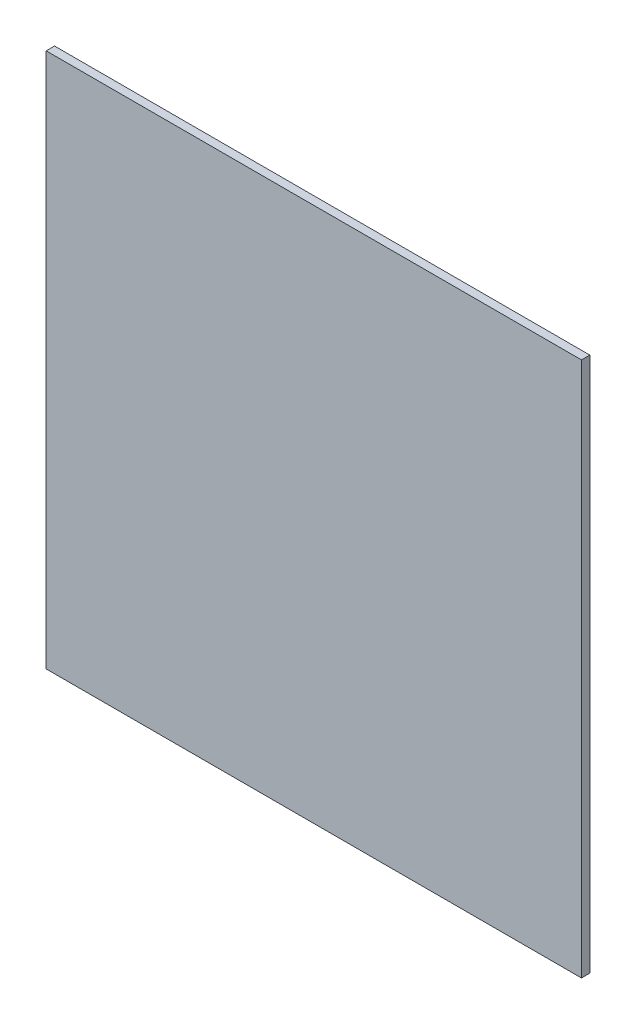
ISO-10303-21;
HEADER;
FILE_DESCRIPTION(('STEP AP214'),'2;1');
FILE_NAME('part.step','',(''),(''),'','','');
FILE_SCHEMA(('AUTOMOTIVE_DESIGN { 1 0 10303 214 1 1 1 1 }'));
ENDSEC;
DATA;
#1=APPLICATION_CONTEXT('core data for automotive mechanical design processes');
#2=APPLICATION_PROTOCOL_DEFINITION('international standard','automotive_design',2000,#1);
#3=PRODUCT_CONTEXT('',#1,'mechanical');
#4=PRODUCT('Part','Part','',(#3));
#5=PRODUCT_RELATED_PRODUCT_CATEGORY('part','',(#4));
#6=PRODUCT_DEFINITION_FORMATION('','',#4);
#7=PRODUCT_DEFINITION_CONTEXT('part definition',#1,'design');
#8=PRODUCT_DEFINITION('design','',#6,#7);
#9=PRODUCT_DEFINITION_SHAPE('','',#8);
#10=(LENGTH_UNIT() NAMED_UNIT(*) SI_UNIT(.MILLI.,.METRE.));
#11=(NAMED_UNIT(*) PLANE_ANGLE_UNIT() SI_UNIT($,.RADIAN.));
#12=(NAMED_UNIT(*) SI_UNIT($,.STERADIAN.) SOLID_ANGLE_UNIT());
#13=UNCERTAINTY_MEASURE_WITH_UNIT(LENGTH_MEASURE(1.E-05),#10,'distance_accuracy_value','');
#14=(GEOMETRIC_REPRESENTATION_CONTEXT(3) GLOBAL_UNCERTAINTY_ASSIGNED_CONTEXT((#13)) GLOBAL_UNIT_ASSIGNED_CONTEXT((#10,
#11,#12)) REPRESENTATION_CONTEXT('',''));
#15=CARTESIAN_POINT('',(0.,0.,0.));
#16=DIRECTION('',(0.,0.,1.));
#17=DIRECTION('',(1.,0.,0.));
#18=AXIS2_PLACEMENT_3D('',#15,#16,#17);
#19=CARTESIAN_POINT('',(-609.6,609.6,0.));
#20=DIRECTION('',(-1.,0.,0.));
#21=DIRECTION('',(0.,-1.,0.));
#22=AXIS2_PLACEMENT_3D('',#19,#20,#21);
#23=PLANE('',#22);
#24=DIRECTION('',(0.,-1.,0.));
#25=VECTOR('',#24,1.);
#26=CARTESIAN_POINT('',(-609.6,609.6,19.05));
#27=LINE('',#26,#25);
#28=CARTESIAN_POINT('',(-609.6,609.6,19.05));
#29=VERTEX_POINT('',#28);
#30=CARTESIAN_POINT('',(-609.6,-609.6,19.05));
#31=VERTEX_POINT('',#30);
#32=EDGE_CURVE('E110',#29,#31,#27,.T.);
#33=ORIENTED_EDGE('',*,*,#32,.F.);
#34=DIRECTION('',(0.,0.,1.));
#35=VECTOR('',#34,1.);
#36=CARTESIAN_POINT('',(-609.6,609.6,0.));
#37=LINE('',#36,#35);
#38=CARTESIAN_POINT('',(-609.6,609.6,0.));
#39=VERTEX_POINT('',#38);
#40=EDGE_CURVE('E12',#39,#29,#37,.T.);
#41=ORIENTED_EDGE('',*,*,#40,.F.);
#42=DIRECTION('',(0.,-1.,0.));
#43=VECTOR('',#42,1.);
#44=CARTESIAN_POINT('',(-609.6,609.6,0.));
#45=LINE('',#44,#43);
#46=CARTESIAN_POINT('',(-609.6,-609.6,0.));
#47=VERTEX_POINT('',#46);
#48=EDGE_CURVE('E104',#39,#47,#45,.T.);
#49=ORIENTED_EDGE('',*,*,#48,.T.);
#50=DIRECTION('',(0.,0.,1.));
#51=VECTOR('',#50,1.);
#52=CARTESIAN_POINT('',(-609.6,-609.6,0.));
#53=LINE('',#52,#51);
#54=EDGE_CURVE('E49',#47,#31,#53,.T.);
#55=ORIENTED_EDGE('',*,*,#54,.T.);
#56=EDGE_LOOP('',(#33,#41,#49,#55));
#57=FACE_BOUND('',#56,.T.);
#58=ADVANCED_FACE('F46',(#57),#23,.T.);
#59=CARTESIAN_POINT('',(609.6,609.6,0.));
#60=DIRECTION('',(0.,1.,0.));
#61=DIRECTION('',(-1.,0.,0.));
#62=AXIS2_PLACEMENT_3D('',#59,#60,#61);
#63=PLANE('',#62);
#64=DIRECTION('',(-1.,0.,0.));
#65=VECTOR('',#64,1.);
#66=CARTESIAN_POINT('',(609.6,609.6,19.05));
#67=LINE('',#66,#65);
#68=CARTESIAN_POINT('',(609.6,609.6,19.05));
#69=VERTEX_POINT('',#68);
#70=EDGE_CURVE('E106',#69,#29,#67,.T.);
#71=ORIENTED_EDGE('',*,*,#70,.F.);
#72=DIRECTION('',(0.,0.,1.));
#73=VECTOR('',#72,1.);
#74=CARTESIAN_POINT('',(609.6,609.6,0.));
#75=LINE('',#74,#73);
#76=CARTESIAN_POINT('',(609.6,609.6,0.));
#77=VERTEX_POINT('',#76);
#78=EDGE_CURVE('E55',#77,#69,#75,.T.);
#79=ORIENTED_EDGE('',*,*,#78,.F.);
#80=DIRECTION('',(-1.,0.,0.));
#81=VECTOR('',#80,1.);
#82=CARTESIAN_POINT('',(609.6,609.6,0.));
#83=LINE('',#82,#81);
#84=EDGE_CURVE('E101',#77,#39,#83,.T.);
#85=ORIENTED_EDGE('',*,*,#84,.T.);
#86=ORIENTED_EDGE('',*,*,#40,.T.);
#87=EDGE_LOOP('',(#71,#79,#85,#86));
#88=FACE_BOUND('',#87,.T.);
#89=ADVANCED_FACE('F120',(#88),#63,.T.);
#90=CARTESIAN_POINT('',(609.6,609.6,0.));
#91=DIRECTION('',(1.,0.,0.));
#92=DIRECTION('',(0.,1.,0.));
#93=AXIS2_PLACEMENT_3D('',#90,#91,#92);
#94=PLANE('',#93);
#95=DIRECTION('',(0.,1.,0.));
#96=VECTOR('',#95,1.);
#97=CARTESIAN_POINT('',(609.6,609.6,19.05));
#98=LINE('',#97,#96);
#99=CARTESIAN_POINT('',(609.6,-609.6,19.05));
#100=VERTEX_POINT('',#99);
#101=EDGE_CURVE('E96',#100,#69,#98,.T.);
#102=ORIENTED_EDGE('',*,*,#101,.F.);
#103=DIRECTION('',(0.,0.,1.));
#104=VECTOR('',#103,1.);
#105=CARTESIAN_POINT('',(609.6,-609.6,0.));
#106=LINE('',#105,#104);
#107=CARTESIAN_POINT('',(609.6,-609.6,0.));
#108=VERTEX_POINT('',#107);
#109=EDGE_CURVE('E91',#108,#100,#106,.T.);
#110=ORIENTED_EDGE('',*,*,#109,.F.);
#111=DIRECTION('',(0.,1.,0.));
#112=VECTOR('',#111,1.);
#113=CARTESIAN_POINT('',(609.6,609.6,0.));
#114=LINE('',#113,#112);
#115=EDGE_CURVE('E94',#108,#77,#114,.T.);
#116=ORIENTED_EDGE('',*,*,#115,.T.);
#117=ORIENTED_EDGE('',*,*,#78,.T.);
#118=EDGE_LOOP('',(#102,#110,#116,#117));
#119=FACE_BOUND('',#118,.T.);
#120=ADVANCED_FACE('F93',(#119),#94,.T.);
#121=CARTESIAN_POINT('',(609.6,-609.6,0.));
#122=DIRECTION('',(0.,-1.,0.));
#123=DIRECTION('',(1.,0.,0.));
#124=AXIS2_PLACEMENT_3D('',#121,#122,#123);
#125=PLANE('',#124);
#126=DIRECTION('',(1.,0.,0.));
#127=VECTOR('',#126,1.);
#128=CARTESIAN_POINT('',(609.6,-609.6,19.05));
#129=LINE('',#128,#127);
#130=EDGE_CURVE('E113',#31,#100,#129,.T.);
#131=ORIENTED_EDGE('',*,*,#130,.F.);
#132=ORIENTED_EDGE('',*,*,#54,.F.);
#133=DIRECTION('',(1.,0.,0.));
#134=VECTOR('',#133,1.);
#135=CARTESIAN_POINT('',(609.6,-609.6,0.));
#136=LINE('',#135,#134);
#137=EDGE_CURVE('E100',#47,#108,#136,.T.);
#138=ORIENTED_EDGE('',*,*,#137,.T.);
#139=ORIENTED_EDGE('',*,*,#109,.T.);
#140=EDGE_LOOP('',(#131,#132,#138,#139));
#141=FACE_BOUND('',#140,.T.);
#142=ADVANCED_FACE('F103',(#141),#125,.T.);
#143=CARTESIAN_POINT('',(0.,0.,0.));
#144=DIRECTION('',(0.,0.,-1.));
#145=DIRECTION('',(-1.,0.,0.));
#146=AXIS2_PLACEMENT_3D('',#143,#144,#145);
#147=PLANE('',#146);
#148=ORIENTED_EDGE('',*,*,#48,.F.);
#149=ORIENTED_EDGE('',*,*,#84,.F.);
#150=ORIENTED_EDGE('',*,*,#115,.F.);
#151=ORIENTED_EDGE('',*,*,#137,.F.);
#152=EDGE_LOOP('',(#148,#149,#150,#151));
#153=FACE_BOUND('',#152,.T.);
#154=ADVANCED_FACE('F99',(#153),#147,.T.);
#155=CARTESIAN_POINT('',(0.,0.,19.05));
#156=DIRECTION('',(0.,0.,-1.));
#157=DIRECTION('',(-1.,0.,0.));
#158=AXIS2_PLACEMENT_3D('',#155,#156,#157);
#159=PLANE('',#158);
#160=ORIENTED_EDGE('',*,*,#32,.T.);
#161=ORIENTED_EDGE('',*,*,#130,.T.);
#162=ORIENTED_EDGE('',*,*,#101,.T.);
#163=ORIENTED_EDGE('',*,*,#70,.T.);
#164=EDGE_LOOP('',(#160,#161,#162,#163));
#165=FACE_BOUND('',#164,.T.);
#166=ADVANCED_FACE('F119',(#165),#159,.F.);
#167=CLOSED_SHELL('',(#58,#89,#120,#142,#154,#166));
#168=MANIFOLD_SOLID_BREP('B2',#167);
#169=CARTESIAN_POINT('',(762.,0.,19.05));
#170=DIRECTION('',(0.,0.,-1.));
#171=DIRECTION('',(-1.,0.,0.));
#172=AXIS2_PLACEMENT_3D('',#169,#170,#171);
#173=CYLINDRICAL_SURFACE('',#172,584.2);
#174=CARTESIAN_POINT('',(762.,0.,0.));
#175=DIRECTION('',(0.,0.,1.));
#176=DIRECTION('',(1.,0.,0.));
#177=AXIS2_PLACEMENT_3D('',#174,#175,#176);
#178=CIRCLE('',#177,584.2);
#179=CARTESIAN_POINT('',(562.191832269146,548.968429063128,0.));
#180=VERTEX_POINT('',#179);
#181=CARTESIAN_POINT('',(562.191832269146,-548.968429063128,0.));
#182=VERTEX_POINT('',#181);
#183=EDGE_CURVE('E243',#180,#182,#178,.T.);
#184=ORIENTED_EDGE('',*,*,#183,.T.);
#185=DIRECTION('',(0.,0.,-1.));
#186=VECTOR('',#185,1.);
#187=CARTESIAN_POINT('',(562.191832269146,-548.968429063128,19.05));
#188=LINE('',#187,#186);
#189=CARTESIAN_POINT('',(562.191832269146,-548.968429063128,19.05));
#190=VERTEX_POINT('',#189);
#191=EDGE_CURVE('E44',#190,#182,#188,.T.);
#192=ORIENTED_EDGE('',*,*,#191,.F.);
#193=CARTESIAN_POINT('',(762.,0.,19.05));
#194=DIRECTION('',(0.,0.,1.));
#195=DIRECTION('',(1.,0.,0.));
#196=AXIS2_PLACEMENT_3D('',#193,#194,#195);
#197=CIRCLE('',#196,584.2);
#198=CARTESIAN_POINT('',(562.191832269146,548.968429063128,19.05));
#199=VERTEX_POINT('',#198);
#200=EDGE_CURVE('E231',#199,#190,#197,.T.);
#201=ORIENTED_EDGE('',*,*,#200,.F.);
#202=DIRECTION('',(0.,0.,-1.));
#203=VECTOR('',#202,1.);
#204=CARTESIAN_POINT('',(562.191832269146,548.968429063128,19.05));
#205=LINE('',#204,#203);
#206=EDGE_CURVE('E239',#199,#180,#205,.T.);
#207=ORIENTED_EDGE('',*,*,#206,.T.);
#208=EDGE_LOOP('',(#184,#192,#201,#207));
#209=FACE_BOUND('',#208,.T.);
#210=ADVANCED_FACE('F180',(#209),#173,.T.);
#211=CARTESIAN_POINT('',(579.56645555009,-501.232043927204,19.05));
#212=DIRECTION('',(-0.939692620785909,0.342020143325667,0.));
#213=DIRECTION('',(-0.342020143325667,-0.939692620785909,0.));
#214=AXIS2_PLACEMENT_3D('',#211,#212,#213);
#215=PLANE('',#214);
#216=DIRECTION('',(0.342020143325667,0.939692620785909,0.));
#217=VECTOR('',#216,1.);
#218=CARTESIAN_POINT('',(579.56645555009,-501.232043927204,0.));
#219=LINE('',#218,#217);
#220=CARTESIAN_POINT('',(579.56645555009,-501.232043927204,0.));
#221=VERTEX_POINT('',#220);
#222=EDGE_CURVE('E235',#182,#221,#219,.T.);
#223=ORIENTED_EDGE('',*,*,#222,.T.);
#224=DIRECTION('',(0.,0.,-1.));
#225=VECTOR('',#224,1.);
#226=CARTESIAN_POINT('',(579.56645555009,-501.232043927204,19.05));
#227=LINE('',#226,#225);
#228=CARTESIAN_POINT('',(579.56645555009,-501.232043927204,19.05));
#229=VERTEX_POINT('',#228);
#230=EDGE_CURVE('E188',#229,#221,#227,.T.);
#231=ORIENTED_EDGE('',*,*,#230,.F.);
#232=DIRECTION('',(0.342020143325667,0.939692620785909,0.));
#233=VECTOR('',#232,1.);
#234=CARTESIAN_POINT('',(579.56645555009,-501.232043927204,19.05));
#235=LINE('',#234,#233);
#236=EDGE_CURVE('E226',#190,#229,#235,.T.);
#237=ORIENTED_EDGE('',*,*,#236,.F.);
#238=ORIENTED_EDGE('',*,*,#191,.T.);
#239=EDGE_LOOP('',(#223,#231,#237,#238));
#240=FACE_BOUND('',#239,.T.);
#241=ADVANCED_FACE('F234',(#240),#215,.F.);
#242=CARTESIAN_POINT('',(762.,0.,19.05));
#243=DIRECTION('',(0.,0.,-1.));
#244=DIRECTION('',(-1.,0.,0.));
#245=AXIS2_PLACEMENT_3D('',#242,#243,#244);
#246=CYLINDRICAL_SURFACE('',#245,533.4);
#247=CARTESIAN_POINT('',(762.,0.,0.));
#248=DIRECTION('',(0.,0.,-1.));
#249=DIRECTION('',(1.,0.,0.));
#250=AXIS2_PLACEMENT_3D('',#247,#248,#249);
#251=CIRCLE('',#250,533.4);
#252=CARTESIAN_POINT('',(579.56645555009,501.232043927204,0.));
#253=VERTEX_POINT('',#252);
#254=EDGE_CURVE('E213',#221,#253,#251,.T.);
#255=ORIENTED_EDGE('',*,*,#254,.T.);
#256=DIRECTION('',(0.,0.,-1.));
#257=VECTOR('',#256,1.);
#258=CARTESIAN_POINT('',(579.56645555009,501.232043927204,19.05));
#259=LINE('',#258,#257);
#260=CARTESIAN_POINT('',(579.56645555009,501.232043927204,19.05));
#261=VERTEX_POINT('',#260);
#262=EDGE_CURVE('E236',#261,#253,#259,.T.);
#263=ORIENTED_EDGE('',*,*,#262,.F.);
#264=CARTESIAN_POINT('',(762.,0.,19.05));
#265=DIRECTION('',(0.,0.,-1.));
#266=DIRECTION('',(1.,0.,0.));
#267=AXIS2_PLACEMENT_3D('',#264,#265,#266);
#268=CIRCLE('',#267,533.4);
#269=EDGE_CURVE('E229',#229,#261,#268,.T.);
#270=ORIENTED_EDGE('',*,*,#269,.F.);
#271=ORIENTED_EDGE('',*,*,#230,.T.);
#272=EDGE_LOOP('',(#255,#263,#270,#271));
#273=FACE_BOUND('',#272,.T.);
#274=ADVANCED_FACE('F237',(#273),#246,.F.);
#275=CARTESIAN_POINT('',(562.191832269146,548.968429063128,19.05));
#276=DIRECTION('',(-0.939692620785909,-0.342020143325667,0.));
#277=DIRECTION('',(0.342020143325667,-0.939692620785909,0.));
#278=AXIS2_PLACEMENT_3D('',#275,#276,#277);
#279=PLANE('',#278);
#280=DIRECTION('',(-0.342020143325667,0.939692620785909,0.));
#281=VECTOR('',#280,1.);
#282=CARTESIAN_POINT('',(562.191832269146,548.968429063128,0.));
#283=LINE('',#282,#281);
#284=EDGE_CURVE('E219',#253,#180,#283,.T.);
#285=ORIENTED_EDGE('',*,*,#284,.T.);
#286=ORIENTED_EDGE('',*,*,#206,.F.);
#287=DIRECTION('',(-0.342020143325667,0.939692620785909,0.));
#288=VECTOR('',#287,1.);
#289=CARTESIAN_POINT('',(562.191832269146,548.968429063128,19.05));
#290=LINE('',#289,#288);
#291=EDGE_CURVE('E196',#261,#199,#290,.T.);
#292=ORIENTED_EDGE('',*,*,#291,.F.);
#293=ORIENTED_EDGE('',*,*,#262,.T.);
#294=EDGE_LOOP('',(#285,#286,#292,#293));
#295=FACE_BOUND('',#294,.T.);
#296=ADVANCED_FACE('F250',(#295),#279,.F.);
#297=CARTESIAN_POINT('',(762.,0.,19.05));
#298=DIRECTION('',(0.,0.,1.));
#299=DIRECTION('',(1.,0.,0.));
#300=AXIS2_PLACEMENT_3D('',#297,#298,#299);
#301=PLANE('',#300);
#302=ORIENTED_EDGE('',*,*,#200,.T.);
#303=ORIENTED_EDGE('',*,*,#236,.T.);
#304=ORIENTED_EDGE('',*,*,#269,.T.);
#305=ORIENTED_EDGE('',*,*,#291,.T.);
#306=EDGE_LOOP('',(#302,#303,#304,#305));
#307=FACE_BOUND('',#306,.T.);
#308=ADVANCED_FACE('F227',(#307),#301,.T.);
#309=CARTESIAN_POINT('',(762.,0.,0.));
#310=DIRECTION('',(0.,0.,1.));
#311=DIRECTION('',(1.,0.,0.));
#312=AXIS2_PLACEMENT_3D('',#309,#310,#311);
#313=PLANE('',#312);
#314=ORIENTED_EDGE('',*,*,#183,.F.);
#315=ORIENTED_EDGE('',*,*,#284,.F.);
#316=ORIENTED_EDGE('',*,*,#254,.F.);
#317=ORIENTED_EDGE('',*,*,#222,.F.);
#318=EDGE_LOOP('',(#314,#315,#316,#317));
#319=FACE_BOUND('',#318,.T.);
#320=ADVANCED_FACE('F253',(#319),#313,.F.);
#321=CLOSED_SHELL('',(#210,#241,#274,#296,#308,#320));
#322=MANIFOLD_SOLID_BREP('B6',#321);
#323=CARTESIAN_POINT('',(609.6,0.,19.05));
#324=DIRECTION('',(0.,0.,-1.));
#325=DIRECTION('',(-1.,0.,0.));
#326=AXIS2_PLACEMENT_3D('',#323,#324,#325);
#327=CYLINDRICAL_SURFACE('',#326,584.2);
#328=CARTESIAN_POINT('',(609.6,0.,0.));
#329=DIRECTION('',(0.,0.,1.));
#330=DIRECTION('',(1.,0.,0.));
#331=AXIS2_PLACEMENT_3D('',#328,#329,#330);
#332=CIRCLE('',#331,584.2);
#333=CARTESIAN_POINT('',(409.791832269146,548.968429063128,0.));
#334=VERTEX_POINT('',#333);
#335=CARTESIAN_POINT('',(409.791832269146,-548.968429063128,0.));
#336=VERTEX_POINT('',#335);
#337=EDGE_CURVE('E377',#334,#336,#332,.T.);
#338=ORIENTED_EDGE('',*,*,#337,.T.);
#339=DIRECTION('',(0.,0.,-1.));
#340=VECTOR('',#339,1.);
#341=CARTESIAN_POINT('',(409.791832269146,-548.968429063128,19.05));
#342=LINE('',#341,#340);
#343=CARTESIAN_POINT('',(409.791832269146,-548.968429063128,19.05));
#344=VERTEX_POINT('',#343);
#345=EDGE_CURVE('E178',#344,#336,#342,.T.);
#346=ORIENTED_EDGE('',*,*,#345,.F.);
#347=CARTESIAN_POINT('',(609.6,0.,19.05));
#348=DIRECTION('',(0.,0.,1.));
#349=DIRECTION('',(1.,0.,0.));
#350=AXIS2_PLACEMENT_3D('',#347,#348,#349);
#351=CIRCLE('',#350,584.2);
#352=CARTESIAN_POINT('',(409.791832269146,548.968429063128,19.05));
#353=VERTEX_POINT('',#352);
#354=EDGE_CURVE('E365',#353,#344,#351,.T.);
#355=ORIENTED_EDGE('',*,*,#354,.F.);
#356=DIRECTION('',(0.,0.,-1.));
#357=VECTOR('',#356,1.);
#358=CARTESIAN_POINT('',(409.791832269146,548.968429063128,19.05));
#359=LINE('',#358,#357);
#360=EDGE_CURVE('E373',#353,#334,#359,.T.);
#361=ORIENTED_EDGE('',*,*,#360,.T.);
#362=EDGE_LOOP('',(#338,#346,#355,#361));
#363=FACE_BOUND('',#362,.T.);
#364=ADVANCED_FACE('F314',(#363),#327,.T.);
#365=CARTESIAN_POINT('',(427.16645555009,-501.232043927204,19.05));
#366=DIRECTION('',(-0.93969262078591,0.342020143325666,0.));
#367=DIRECTION('',(-0.342020143325666,-0.93969262078591,0.));
#368=AXIS2_PLACEMENT_3D('',#365,#366,#367);
#369=PLANE('',#368);
#370=DIRECTION('',(0.342020143325666,0.939692620785909,0.));
#371=VECTOR('',#370,1.);
#372=CARTESIAN_POINT('',(427.16645555009,-501.232043927204,0.));
#373=LINE('',#372,#371);
#374=CARTESIAN_POINT('',(427.16645555009,-501.232043927204,0.));
#375=VERTEX_POINT('',#374);
#376=EDGE_CURVE('E369',#336,#375,#373,.T.);
#377=ORIENTED_EDGE('',*,*,#376,.T.);
#378=DIRECTION('',(0.,0.,-1.));
#379=VECTOR('',#378,1.);
#380=CARTESIAN_POINT('',(427.16645555009,-501.232043927204,19.05));
#381=LINE('',#380,#379);
#382=CARTESIAN_POINT('',(427.16645555009,-501.232043927204,19.05));
#383=VERTEX_POINT('',#382);
#384=EDGE_CURVE('E322',#383,#375,#381,.T.);
#385=ORIENTED_EDGE('',*,*,#384,.F.);
#386=DIRECTION('',(0.342020143325666,0.939692620785909,0.));
#387=VECTOR('',#386,1.);
#388=CARTESIAN_POINT('',(427.16645555009,-501.232043927204,19.05));
#389=LINE('',#388,#387);
#390=EDGE_CURVE('E360',#344,#383,#389,.T.);
#391=ORIENTED_EDGE('',*,*,#390,.F.);
#392=ORIENTED_EDGE('',*,*,#345,.T.);
#393=EDGE_LOOP('',(#377,#385,#391,#392));
#394=FACE_BOUND('',#393,.T.);
#395=ADVANCED_FACE('F368',(#394),#369,.F.);
#396=CARTESIAN_POINT('',(609.6,0.,19.05));
#397=DIRECTION('',(0.,0.,-1.));
#398=DIRECTION('',(-1.,0.,0.));
#399=AXIS2_PLACEMENT_3D('',#396,#397,#398);
#400=CYLINDRICAL_SURFACE('',#399,533.4);
#401=CARTESIAN_POINT('',(609.6,0.,0.));
#402=DIRECTION('',(0.,0.,-1.));
#403=DIRECTION('',(1.,0.,0.));
#404=AXIS2_PLACEMENT_3D('',#401,#402,#403);
#405=CIRCLE('',#404,533.4);
#406=CARTESIAN_POINT('',(427.16645555009,501.232043927204,0.));
#407=VERTEX_POINT('',#406);
#408=EDGE_CURVE('E347',#375,#407,#405,.T.);
#409=ORIENTED_EDGE('',*,*,#408,.T.);
#410=DIRECTION('',(0.,0.,-1.));
#411=VECTOR('',#410,1.);
#412=CARTESIAN_POINT('',(427.16645555009,501.232043927204,19.05));
#413=LINE('',#412,#411);
#414=CARTESIAN_POINT('',(427.16645555009,501.232043927204,19.05));
#415=VERTEX_POINT('',#414);
#416=EDGE_CURVE('E370',#415,#407,#413,.T.);
#417=ORIENTED_EDGE('',*,*,#416,.F.);
#418=CARTESIAN_POINT('',(609.6,0.,19.05));
#419=DIRECTION('',(0.,0.,-1.));
#420=DIRECTION('',(1.,0.,0.));
#421=AXIS2_PLACEMENT_3D('',#418,#419,#420);
#422=CIRCLE('',#421,533.4);
#423=EDGE_CURVE('E363',#383,#415,#422,.T.);
#424=ORIENTED_EDGE('',*,*,#423,.F.);
#425=ORIENTED_EDGE('',*,*,#384,.T.);
#426=EDGE_LOOP('',(#409,#417,#424,#425));
#427=FACE_BOUND('',#426,.T.);
#428=ADVANCED_FACE('F371',(#427),#400,.F.);
#429=CARTESIAN_POINT('',(409.791832269146,548.968429063128,19.05));
#430=DIRECTION('',(-0.93969262078591,-0.342020143325666,0.));
#431=DIRECTION('',(0.342020143325666,-0.93969262078591,0.));
#432=AXIS2_PLACEMENT_3D('',#429,#430,#431);
#433=PLANE('',#432);
#434=DIRECTION('',(-0.342020143325666,0.939692620785909,0.));
#435=VECTOR('',#434,1.);
#436=CARTESIAN_POINT('',(409.791832269146,548.968429063128,0.));
#437=LINE('',#436,#435);
#438=EDGE_CURVE('E353',#407,#334,#437,.T.);
#439=ORIENTED_EDGE('',*,*,#438,.T.);
#440=ORIENTED_EDGE('',*,*,#360,.F.);
#441=DIRECTION('',(-0.342020143325666,0.939692620785909,0.));
#442=VECTOR('',#441,1.);
#443=CARTESIAN_POINT('',(409.791832269146,548.968429063128,19.05));
#444=LINE('',#443,#442);
#445=EDGE_CURVE('E330',#415,#353,#444,.T.);
#446=ORIENTED_EDGE('',*,*,#445,.F.);
#447=ORIENTED_EDGE('',*,*,#416,.T.);
#448=EDGE_LOOP('',(#439,#440,#446,#447));
#449=FACE_BOUND('',#448,.T.);
#450=ADVANCED_FACE('F384',(#449),#433,.F.);
#451=CARTESIAN_POINT('',(609.6,0.,19.05));
#452=DIRECTION('',(0.,0.,1.));
#453=DIRECTION('',(1.,0.,0.));
#454=AXIS2_PLACEMENT_3D('',#451,#452,#453);
#455=PLANE('',#454);
#456=ORIENTED_EDGE('',*,*,#354,.T.);
#457=ORIENTED_EDGE('',*,*,#390,.T.);
#458=ORIENTED_EDGE('',*,*,#423,.T.);
#459=ORIENTED_EDGE('',*,*,#445,.T.);
#460=EDGE_LOOP('',(#456,#457,#458,#459));
#461=FACE_BOUND('',#460,.T.);
#462=ADVANCED_FACE('F361',(#461),#455,.T.);
#463=CARTESIAN_POINT('',(609.6,0.,0.));
#464=DIRECTION('',(0.,0.,1.));
#465=DIRECTION('',(1.,0.,0.));
#466=AXIS2_PLACEMENT_3D('',#463,#464,#465);
#467=PLANE('',#466);
#468=ORIENTED_EDGE('',*,*,#337,.F.);
#469=ORIENTED_EDGE('',*,*,#438,.F.);
#470=ORIENTED_EDGE('',*,*,#408,.F.);
#471=ORIENTED_EDGE('',*,*,#376,.F.);
#472=EDGE_LOOP('',(#468,#469,#470,#471));
#473=FACE_BOUND('',#472,.T.);
#474=ADVANCED_FACE('F387',(#473),#467,.F.);
#475=CLOSED_SHELL('',(#364,#395,#428,#450,#462,#474));
#476=MANIFOLD_SOLID_BREP('B38',#475);
#477=CARTESIAN_POINT('',(457.2,0.,19.05));
#478=DIRECTION('',(0.,0.,-1.));
#479=DIRECTION('',(-1.,0.,0.));
#480=AXIS2_PLACEMENT_3D('',#477,#478,#479);
#481=CYLINDRICAL_SURFACE('',#480,584.2);
#482=CARTESIAN_POINT('',(457.2,0.,0.));
#483=DIRECTION('',(0.,0.,1.));
#484=DIRECTION('',(1.,0.,0.));
#485=AXIS2_PLACEMENT_3D('',#482,#483,#484);
#486=CIRCLE('',#485,584.2);
#487=CARTESIAN_POINT('',(257.391832269146,548.968429063128,0.));
#488=VERTEX_POINT('',#487);
#489=CARTESIAN_POINT('',(257.391832269146,-548.968429063128,0.));
#490=VERTEX_POINT('',#489);
#491=EDGE_CURVE('E511',#488,#490,#486,.T.);
#492=ORIENTED_EDGE('',*,*,#491,.T.);
#493=DIRECTION('',(0.,0.,-1.));
#494=VECTOR('',#493,1.);
#495=CARTESIAN_POINT('',(257.391832269146,-548.968429063128,19.05));
#496=LINE('',#495,#494);
#497=CARTESIAN_POINT('',(257.391832269146,-548.968429063128,19.05));
#498=VERTEX_POINT('',#497);
#499=EDGE_CURVE('E312',#498,#490,#496,.T.);
#500=ORIENTED_EDGE('',*,*,#499,.F.);
#501=CARTESIAN_POINT('',(457.2,0.,19.05));
#502=DIRECTION('',(0.,0.,1.));
#503=DIRECTION('',(1.,0.,0.));
#504=AXIS2_PLACEMENT_3D('',#501,#502,#503);
#505=CIRCLE('',#504,584.2);
#506=CARTESIAN_POINT('',(257.391832269146,548.968429063128,19.05));
#507=VERTEX_POINT('',#506);
#508=EDGE_CURVE('E499',#507,#498,#505,.T.);
#509=ORIENTED_EDGE('',*,*,#508,.F.);
#510=DIRECTION('',(0.,0.,-1.));
#511=VECTOR('',#510,1.);
#512=CARTESIAN_POINT('',(257.391832269146,548.968429063128,19.05));
#513=LINE('',#512,#511);
#514=EDGE_CURVE('E507',#507,#488,#513,.T.);
#515=ORIENTED_EDGE('',*,*,#514,.T.);
#516=EDGE_LOOP('',(#492,#500,#509,#515));
#517=FACE_BOUND('',#516,.T.);
#518=ADVANCED_FACE('F448',(#517),#481,.T.);
#519=CARTESIAN_POINT('',(274.76645555009,-501.232043927204,19.05));
#520=DIRECTION('',(-0.93969262078591,0.342020143325666,0.));
#521=DIRECTION('',(-0.342020143325666,-0.93969262078591,0.));
#522=AXIS2_PLACEMENT_3D('',#519,#520,#521);
#523=PLANE('',#522);
#524=DIRECTION('',(0.342020143325666,0.939692620785909,0.));
#525=VECTOR('',#524,1.);
#526=CARTESIAN_POINT('',(274.76645555009,-501.232043927204,0.));
#527=LINE('',#526,#525);
#528=CARTESIAN_POINT('',(274.76645555009,-501.232043927204,0.));
#529=VERTEX_POINT('',#528);
#530=EDGE_CURVE('E503',#490,#529,#527,.T.);
#531=ORIENTED_EDGE('',*,*,#530,.T.);
#532=DIRECTION('',(0.,0.,-1.));
#533=VECTOR('',#532,1.);
#534=CARTESIAN_POINT('',(274.76645555009,-501.232043927204,19.05));
#535=LINE('',#534,#533);
#536=CARTESIAN_POINT('',(274.76645555009,-501.232043927204,19.05));
#537=VERTEX_POINT('',#536);
#538=EDGE_CURVE('E456',#537,#529,#535,.T.);
#539=ORIENTED_EDGE('',*,*,#538,.F.);
#540=DIRECTION('',(0.342020143325666,0.939692620785909,0.));
#541=VECTOR('',#540,1.);
#542=CARTESIAN_POINT('',(274.76645555009,-501.232043927204,19.05));
#543=LINE('',#542,#541);
#544=EDGE_CURVE('E494',#498,#537,#543,.T.);
#545=ORIENTED_EDGE('',*,*,#544,.F.);
#546=ORIENTED_EDGE('',*,*,#499,.T.);
#547=EDGE_LOOP('',(#531,#539,#545,#546));
#548=FACE_BOUND('',#547,.T.);
#549=ADVANCED_FACE('F502',(#548),#523,.F.);
#550=CARTESIAN_POINT('',(457.2,0.,19.05));
#551=DIRECTION('',(0.,0.,-1.));
#552=DIRECTION('',(-1.,0.,0.));
#553=AXIS2_PLACEMENT_3D('',#550,#551,#552);
#554=CYLINDRICAL_SURFACE('',#553,533.4);
#555=CARTESIAN_POINT('',(457.2,0.,0.));
#556=DIRECTION('',(0.,0.,-1.));
#557=DIRECTION('',(1.,0.,0.));
#558=AXIS2_PLACEMENT_3D('',#555,#556,#557);
#559=CIRCLE('',#558,533.4);
#560=CARTESIAN_POINT('',(274.76645555009,501.232043927204,0.));
#561=VERTEX_POINT('',#560);
#562=EDGE_CURVE('E481',#529,#561,#559,.T.);
#563=ORIENTED_EDGE('',*,*,#562,.T.);
#564=DIRECTION('',(0.,0.,-1.));
#565=VECTOR('',#564,1.);
#566=CARTESIAN_POINT('',(274.76645555009,501.232043927204,19.05));
#567=LINE('',#566,#565);
#568=CARTESIAN_POINT('',(274.76645555009,501.232043927204,19.05));
#569=VERTEX_POINT('',#568);
#570=EDGE_CURVE('E504',#569,#561,#567,.T.);
#571=ORIENTED_EDGE('',*,*,#570,.F.);
#572=CARTESIAN_POINT('',(457.2,0.,19.05));
#573=DIRECTION('',(0.,0.,-1.));
#574=DIRECTION('',(1.,0.,0.));
#575=AXIS2_PLACEMENT_3D('',#572,#573,#574);
#576=CIRCLE('',#575,533.4);
#577=EDGE_CURVE('E497',#537,#569,#576,.T.);
#578=ORIENTED_EDGE('',*,*,#577,.F.);
#579=ORIENTED_EDGE('',*,*,#538,.T.);
#580=EDGE_LOOP('',(#563,#571,#578,#579));
#581=FACE_BOUND('',#580,.T.);
#582=ADVANCED_FACE('F505',(#581),#554,.F.);
#583=CARTESIAN_POINT('',(257.391832269146,548.968429063128,19.05));
#584=DIRECTION('',(-0.93969262078591,-0.342020143325666,0.));
#585=DIRECTION('',(0.342020143325666,-0.93969262078591,0.));
#586=AXIS2_PLACEMENT_3D('',#583,#584,#585);
#587=PLANE('',#586);
#588=DIRECTION('',(-0.342020143325666,0.939692620785909,0.));
#589=VECTOR('',#588,1.);
#590=CARTESIAN_POINT('',(257.391832269146,548.968429063128,0.));
#591=LINE('',#590,#589);
#592=EDGE_CURVE('E487',#561,#488,#591,.T.);
#593=ORIENTED_EDGE('',*,*,#592,.T.);
#594=ORIENTED_EDGE('',*,*,#514,.F.);
#595=DIRECTION('',(-0.342020143325666,0.939692620785909,0.));
#596=VECTOR('',#595,1.);
#597=CARTESIAN_POINT('',(257.391832269146,548.968429063128,19.05));
#598=LINE('',#597,#596);
#599=EDGE_CURVE('E464',#569,#507,#598,.T.);
#600=ORIENTED_EDGE('',*,*,#599,.F.);
#601=ORIENTED_EDGE('',*,*,#570,.T.);
#602=EDGE_LOOP('',(#593,#594,#600,#601));
#603=FACE_BOUND('',#602,.T.);
#604=ADVANCED_FACE('F518',(#603),#587,.F.);
#605=CARTESIAN_POINT('',(457.2,0.,19.05));
#606=DIRECTION('',(0.,0.,1.));
#607=DIRECTION('',(1.,0.,0.));
#608=AXIS2_PLACEMENT_3D('',#605,#606,#607);
#609=PLANE('',#608);
#610=ORIENTED_EDGE('',*,*,#508,.T.);
#611=ORIENTED_EDGE('',*,*,#544,.T.);
#612=ORIENTED_EDGE('',*,*,#577,.T.);
#613=ORIENTED_EDGE('',*,*,#599,.T.);
#614=EDGE_LOOP('',(#610,#611,#612,#613));
#615=FACE_BOUND('',#614,.T.);
#616=ADVANCED_FACE('F495',(#615),#609,.T.);
#617=CARTESIAN_POINT('',(457.2,0.,0.));
#618=DIRECTION('',(0.,0.,1.));
#619=DIRECTION('',(1.,0.,0.));
#620=AXIS2_PLACEMENT_3D('',#617,#618,#619);
#621=PLANE('',#620);
#622=ORIENTED_EDGE('',*,*,#491,.F.);
#623=ORIENTED_EDGE('',*,*,#592,.F.);
#624=ORIENTED_EDGE('',*,*,#562,.F.);
#625=ORIENTED_EDGE('',*,*,#530,.F.);
#626=EDGE_LOOP('',(#622,#623,#624,#625));
#627=FACE_BOUND('',#626,.T.);
#628=ADVANCED_FACE('F521',(#627),#621,.F.);
#629=CLOSED_SHELL('',(#518,#549,#582,#604,#616,#628));
#630=MANIFOLD_SOLID_BREP('B172',#629);
#631=CARTESIAN_POINT('',(304.8,0.,19.05));
#632=DIRECTION('',(0.,0.,-1.));
#633=DIRECTION('',(-1.,0.,0.));
#634=AXIS2_PLACEMENT_3D('',#631,#632,#633);
#635=CYLINDRICAL_SURFACE('',#634,584.2);
#636=CARTESIAN_POINT('',(304.8,0.,0.));
#637=DIRECTION('',(0.,0.,1.));
#638=DIRECTION('',(1.,0.,0.));
#639=AXIS2_PLACEMENT_3D('',#636,#637,#638);
#640=CIRCLE('',#639,584.2);
#641=CARTESIAN_POINT('',(104.991832269146,548.968429063128,0.));
#642=VERTEX_POINT('',#641);
#643=CARTESIAN_POINT('',(104.991832269146,-548.968429063128,0.));
#644=VERTEX_POINT('',#643);
#645=EDGE_CURVE('E645',#642,#644,#640,.T.);
#646=ORIENTED_EDGE('',*,*,#645,.T.);
#647=DIRECTION('',(0.,0.,-1.));
#648=VECTOR('',#647,1.);
#649=CARTESIAN_POINT('',(104.991832269146,-548.968429063128,19.05));
#650=LINE('',#649,#648);
#651=CARTESIAN_POINT('',(104.991832269146,-548.968429063128,19.05));
#652=VERTEX_POINT('',#651);
#653=EDGE_CURVE('E446',#652,#644,#650,.T.);
#654=ORIENTED_EDGE('',*,*,#653,.F.);
#655=CARTESIAN_POINT('',(304.8,0.,19.05));
#656=DIRECTION('',(0.,0.,1.));
#657=DIRECTION('',(1.,0.,0.));
#658=AXIS2_PLACEMENT_3D('',#655,#656,#657);
#659=CIRCLE('',#658,584.2);
#660=CARTESIAN_POINT('',(104.991832269146,548.968429063128,19.05));
#661=VERTEX_POINT('',#660);
#662=EDGE_CURVE('E633',#661,#652,#659,.T.);
#663=ORIENTED_EDGE('',*,*,#662,.F.);
#664=DIRECTION('',(0.,0.,-1.));
#665=VECTOR('',#664,1.);
#666=CARTESIAN_POINT('',(104.991832269146,548.968429063128,19.05));
#667=LINE('',#666,#665);
#668=EDGE_CURVE('E641',#661,#642,#667,.T.);
#669=ORIENTED_EDGE('',*,*,#668,.T.);
#670=EDGE_LOOP('',(#646,#654,#663,#669));
#671=FACE_BOUND('',#670,.T.);
#672=ADVANCED_FACE('F582',(#671),#635,.T.);
#673=CARTESIAN_POINT('',(122.36645555009,-501.232043927204,19.05));
#674=DIRECTION('',(-0.93969262078591,0.342020143325666,0.));
#675=DIRECTION('',(-0.342020143325666,-0.93969262078591,0.));
#676=AXIS2_PLACEMENT_3D('',#673,#674,#675);
#677=PLANE('',#676);
#678=DIRECTION('',(0.342020143325666,0.939692620785909,0.));
#679=VECTOR('',#678,1.);
#680=CARTESIAN_POINT('',(122.36645555009,-501.232043927204,0.));
#681=LINE('',#680,#679);
#682=CARTESIAN_POINT('',(122.36645555009,-501.232043927204,0.));
#683=VERTEX_POINT('',#682);
#684=EDGE_CURVE('E637',#644,#683,#681,.T.);
#685=ORIENTED_EDGE('',*,*,#684,.T.);
#686=DIRECTION('',(0.,0.,-1.));
#687=VECTOR('',#686,1.);
#688=CARTESIAN_POINT('',(122.36645555009,-501.232043927204,19.05));
#689=LINE('',#688,#687);
#690=CARTESIAN_POINT('',(122.36645555009,-501.232043927204,19.05));
#691=VERTEX_POINT('',#690);
#692=EDGE_CURVE('E590',#691,#683,#689,.T.);
#693=ORIENTED_EDGE('',*,*,#692,.F.);
#694=DIRECTION('',(0.342020143325666,0.939692620785909,0.));
#695=VECTOR('',#694,1.);
#696=CARTESIAN_POINT('',(122.36645555009,-501.232043927204,19.05));
#697=LINE('',#696,#695);
#698=EDGE_CURVE('E628',#652,#691,#697,.T.);
#699=ORIENTED_EDGE('',*,*,#698,.F.);
#700=ORIENTED_EDGE('',*,*,#653,.T.);
#701=EDGE_LOOP('',(#685,#693,#699,#700));
#702=FACE_BOUND('',#701,.T.);
#703=ADVANCED_FACE('F636',(#702),#677,.F.);
#704=CARTESIAN_POINT('',(304.8,0.,19.05));
#705=DIRECTION('',(0.,0.,-1.));
#706=DIRECTION('',(-1.,0.,0.));
#707=AXIS2_PLACEMENT_3D('',#704,#705,#706);
#708=CYLINDRICAL_SURFACE('',#707,533.4);
#709=CARTESIAN_POINT('',(304.8,0.,0.));
#710=DIRECTION('',(0.,0.,-1.));
#711=DIRECTION('',(1.,0.,0.));
#712=AXIS2_PLACEMENT_3D('',#709,#710,#711);
#713=CIRCLE('',#712,533.4);
#714=CARTESIAN_POINT('',(122.36645555009,501.232043927204,0.));
#715=VERTEX_POINT('',#714);
#716=EDGE_CURVE('E615',#683,#715,#713,.T.);
#717=ORIENTED_EDGE('',*,*,#716,.T.);
#718=DIRECTION('',(0.,0.,-1.));
#719=VECTOR('',#718,1.);
#720=CARTESIAN_POINT('',(122.36645555009,501.232043927204,19.05));
#721=LINE('',#720,#719);
#722=CARTESIAN_POINT('',(122.36645555009,501.232043927204,19.05));
#723=VERTEX_POINT('',#722);
#724=EDGE_CURVE('E638',#723,#715,#721,.T.);
#725=ORIENTED_EDGE('',*,*,#724,.F.);
#726=CARTESIAN_POINT('',(304.8,0.,19.05));
#727=DIRECTION('',(0.,0.,-1.));
#728=DIRECTION('',(1.,0.,0.));
#729=AXIS2_PLACEMENT_3D('',#726,#727,#728);
#730=CIRCLE('',#729,533.4);
#731=EDGE_CURVE('E631',#691,#723,#730,.T.);
#732=ORIENTED_EDGE('',*,*,#731,.F.);
#733=ORIENTED_EDGE('',*,*,#692,.T.);
#734=EDGE_LOOP('',(#717,#725,#732,#733));
#735=FACE_BOUND('',#734,.T.);
#736=ADVANCED_FACE('F639',(#735),#708,.F.);
#737=CARTESIAN_POINT('',(104.991832269146,548.968429063128,19.05));
#738=DIRECTION('',(-0.939692620785909,-0.342020143325666,0.));
#739=DIRECTION('',(0.342020143325666,-0.939692620785909,0.));
#740=AXIS2_PLACEMENT_3D('',#737,#738,#739);
#741=PLANE('',#740);
#742=DIRECTION('',(-0.342020143325666,0.939692620785909,0.));
#743=VECTOR('',#742,1.);
#744=CARTESIAN_POINT('',(104.991832269146,548.968429063128,0.));
#745=LINE('',#744,#743);
#746=EDGE_CURVE('E621',#715,#642,#745,.T.);
#747=ORIENTED_EDGE('',*,*,#746,.T.);
#748=ORIENTED_EDGE('',*,*,#668,.F.);
#749=DIRECTION('',(-0.342020143325666,0.939692620785909,0.));
#750=VECTOR('',#749,1.);
#751=CARTESIAN_POINT('',(104.991832269146,548.968429063128,19.05));
#752=LINE('',#751,#750);
#753=EDGE_CURVE('E598',#723,#661,#752,.T.);
#754=ORIENTED_EDGE('',*,*,#753,.F.);
#755=ORIENTED_EDGE('',*,*,#724,.T.);
#756=EDGE_LOOP('',(#747,#748,#754,#755));
#757=FACE_BOUND('',#756,.T.);
#758=ADVANCED_FACE('F652',(#757),#741,.F.);
#759=CARTESIAN_POINT('',(304.8,0.,19.05));
#760=DIRECTION('',(0.,0.,1.));
#761=DIRECTION('',(1.,0.,0.));
#762=AXIS2_PLACEMENT_3D('',#759,#760,#761);
#763=PLANE('',#762);
#764=ORIENTED_EDGE('',*,*,#662,.T.);
#765=ORIENTED_EDGE('',*,*,#698,.T.);
#766=ORIENTED_EDGE('',*,*,#731,.T.);
#767=ORIENTED_EDGE('',*,*,#753,.T.);
#768=EDGE_LOOP('',(#764,#765,#766,#767));
#769=FACE_BOUND('',#768,.T.);
#770=ADVANCED_FACE('F629',(#769),#763,.T.);
#771=CARTESIAN_POINT('',(304.8,0.,0.));
#772=DIRECTION('',(0.,0.,1.));
#773=DIRECTION('',(1.,0.,0.));
#774=AXIS2_PLACEMENT_3D('',#771,#772,#773);
#775=PLANE('',#774);
#776=ORIENTED_EDGE('',*,*,#645,.F.);
#777=ORIENTED_EDGE('',*,*,#746,.F.);
#778=ORIENTED_EDGE('',*,*,#716,.F.);
#779=ORIENTED_EDGE('',*,*,#684,.F.);
#780=EDGE_LOOP('',(#776,#777,#778,#779));
#781=FACE_BOUND('',#780,.T.);
#782=ADVANCED_FACE('F655',(#781),#775,.F.);
#783=CLOSED_SHELL('',(#672,#703,#736,#758,#770,#782));
#784=MANIFOLD_SOLID_BREP('B306',#783);
#785=CARTESIAN_POINT('',(152.4,0.,19.05));
#786=DIRECTION('',(0.,0.,-1.));
#787=DIRECTION('',(-1.,0.,0.));
#788=AXIS2_PLACEMENT_3D('',#785,#786,#787);
#789=CYLINDRICAL_SURFACE('',#788,584.2);
#790=CARTESIAN_POINT('',(152.4,0.,0.));
#791=DIRECTION('',(0.,0.,1.));
#792=DIRECTION('',(1.,0.,0.));
#793=AXIS2_PLACEMENT_3D('',#790,#791,#792);
#794=CIRCLE('',#793,584.2);
#795=CARTESIAN_POINT('',(-47.408167730854,548.968429063128,0.));
#796=VERTEX_POINT('',#795);
#797=CARTESIAN_POINT('',(-47.4081677308537,-548.968429063128,0.));
#798=VERTEX_POINT('',#797);
#799=EDGE_CURVE('E778',#796,#798,#794,.T.);
#800=ORIENTED_EDGE('',*,*,#799,.T.);
#801=DIRECTION('',(0.,0.,-1.));
#802=VECTOR('',#801,1.);
#803=CARTESIAN_POINT('',(-47.4081677308537,-548.968429063128,19.05));
#804=LINE('',#803,#802);
#805=CARTESIAN_POINT('',(-47.4081677308537,-548.968429063128,19.05));
#806=VERTEX_POINT('',#805);
#807=EDGE_CURVE('E580',#806,#798,#804,.T.);
#808=ORIENTED_EDGE('',*,*,#807,.F.);
#809=CARTESIAN_POINT('',(152.4,0.,19.05));
#810=DIRECTION('',(0.,0.,1.));
#811=DIRECTION('',(1.,0.,0.));
#812=AXIS2_PLACEMENT_3D('',#809,#810,#811);
#813=CIRCLE('',#812,584.2);
#814=CARTESIAN_POINT('',(-47.408167730854,548.968429063128,19.05));
#815=VERTEX_POINT('',#814);
#816=EDGE_CURVE('E766',#815,#806,#813,.T.);
#817=ORIENTED_EDGE('',*,*,#816,.F.);
#818=DIRECTION('',(0.,0.,-1.));
#819=VECTOR('',#818,1.);
#820=CARTESIAN_POINT('',(-47.408167730854,548.968429063128,19.05));
#821=LINE('',#820,#819);
#822=EDGE_CURVE('E774',#815,#796,#821,.T.);
#823=ORIENTED_EDGE('',*,*,#822,.T.);
#824=EDGE_LOOP('',(#800,#808,#817,#823));
#825=FACE_BOUND('',#824,.T.);
#826=ADVANCED_FACE('F715',(#825),#789,.T.);
#827=CARTESIAN_POINT('',(-30.0335444499099,-501.232043927204,19.05));
#828=DIRECTION('',(-0.93969262078591,0.342020143325666,0.));
#829=DIRECTION('',(-0.342020143325666,-0.93969262078591,0.));
#830=AXIS2_PLACEMENT_3D('',#827,#828,#829);
#831=PLANE('',#830);
#832=DIRECTION('',(0.342020143325666,0.939692620785909,0.));
#833=VECTOR('',#832,1.);
#834=CARTESIAN_POINT('',(-30.0335444499099,-501.232043927204,0.));
#835=LINE('',#834,#833);
#836=CARTESIAN_POINT('',(-30.0335444499098,-501.232043927204,0.));
#837=VERTEX_POINT('',#836);
#838=EDGE_CURVE('E770',#798,#837,#835,.T.);
#839=ORIENTED_EDGE('',*,*,#838,.T.);
#840=DIRECTION('',(0.,0.,-1.));
#841=VECTOR('',#840,1.);
#842=CARTESIAN_POINT('',(-30.0335444499098,-501.232043927204,19.05));
#843=LINE('',#842,#841);
#844=CARTESIAN_POINT('',(-30.0335444499098,-501.232043927204,19.05));
#845=VERTEX_POINT('',#844);
#846=EDGE_CURVE('E723',#845,#837,#843,.T.);
#847=ORIENTED_EDGE('',*,*,#846,.F.);
#848=DIRECTION('',(0.342020143325666,0.939692620785909,0.));
#849=VECTOR('',#848,1.);
#850=CARTESIAN_POINT('',(-30.0335444499099,-501.232043927204,19.05));
#851=LINE('',#850,#849);
#852=EDGE_CURVE('E761',#806,#845,#851,.T.);
#853=ORIENTED_EDGE('',*,*,#852,.F.);
#854=ORIENTED_EDGE('',*,*,#807,.T.);
#855=EDGE_LOOP('',(#839,#847,#853,#854));
#856=FACE_BOUND('',#855,.T.);
#857=ADVANCED_FACE('F769',(#856),#831,.F.);
#858=CARTESIAN_POINT('',(152.4,0.,19.05));
#859=DIRECTION('',(0.,0.,-1.));
#860=DIRECTION('',(-1.,0.,0.));
#861=AXIS2_PLACEMENT_3D('',#858,#859,#860);
#862=CYLINDRICAL_SURFACE('',#861,533.4);
#863=CARTESIAN_POINT('',(152.4,0.,0.));
#864=DIRECTION('',(0.,0.,-1.));
#865=DIRECTION('',(1.,0.,0.));
#866=AXIS2_PLACEMENT_3D('',#863,#864,#865);
#867=CIRCLE('',#866,533.4);
#868=CARTESIAN_POINT('',(-30.0335444499102,501.232043927204,0.));
#869=VERTEX_POINT('',#868);
#870=EDGE_CURVE('E748',#837,#869,#867,.T.);
#871=ORIENTED_EDGE('',*,*,#870,.T.);
#872=DIRECTION('',(0.,0.,-1.));
#873=VECTOR('',#872,1.);
#874=CARTESIAN_POINT('',(-30.0335444499102,501.232043927204,19.05));
#875=LINE('',#874,#873);
#876=CARTESIAN_POINT('',(-30.0335444499102,501.232043927204,19.05));
#877=VERTEX_POINT('',#876);
#878=EDGE_CURVE('E771',#877,#869,#875,.T.);
#879=ORIENTED_EDGE('',*,*,#878,.F.);
#880=CARTESIAN_POINT('',(152.4,0.,19.05));
#881=DIRECTION('',(0.,0.,-1.));
#882=DIRECTION('',(1.,0.,0.));
#883=AXIS2_PLACEMENT_3D('',#880,#881,#882);
#884=CIRCLE('',#883,533.4);
#885=EDGE_CURVE('E764',#845,#877,#884,.T.);
#886=ORIENTED_EDGE('',*,*,#885,.F.);
#887=ORIENTED_EDGE('',*,*,#846,.T.);
#888=EDGE_LOOP('',(#871,#879,#886,#887));
#889=FACE_BOUND('',#888,.T.);
#890=ADVANCED_FACE('F772',(#889),#862,.F.);
#891=CARTESIAN_POINT('',(-47.408167730854,548.968429063128,19.05));
#892=DIRECTION('',(-0.939692620785909,-0.342020143325666,0.));
#893=DIRECTION('',(0.342020143325666,-0.939692620785909,0.));
#894=AXIS2_PLACEMENT_3D('',#891,#892,#893);
#895=PLANE('',#894);
#896=DIRECTION('',(-0.342020143325666,0.939692620785909,0.));
#897=VECTOR('',#896,1.);
#898=CARTESIAN_POINT('',(-47.408167730854,548.968429063128,0.));
#899=LINE('',#898,#897);
#900=EDGE_CURVE('E754',#869,#796,#899,.T.);
#901=ORIENTED_EDGE('',*,*,#900,.T.);
#902=ORIENTED_EDGE('',*,*,#822,.F.);
#903=DIRECTION('',(-0.342020143325666,0.939692620785909,0.));
#904=VECTOR('',#903,1.);
#905=CARTESIAN_POINT('',(-47.408167730854,548.968429063128,19.05));
#906=LINE('',#905,#904);
#907=EDGE_CURVE('E731',#877,#815,#906,.T.);
#908=ORIENTED_EDGE('',*,*,#907,.F.);
#909=ORIENTED_EDGE('',*,*,#878,.T.);
#910=EDGE_LOOP('',(#901,#902,#908,#909));
#911=FACE_BOUND('',#910,.T.);
#912=ADVANCED_FACE('F785',(#911),#895,.F.);
#913=CARTESIAN_POINT('',(152.4,0.,19.05));
#914=DIRECTION('',(0.,0.,1.));
#915=DIRECTION('',(1.,0.,0.));
#916=AXIS2_PLACEMENT_3D('',#913,#914,#915);
#917=PLANE('',#916);
#918=ORIENTED_EDGE('',*,*,#816,.T.);
#919=ORIENTED_EDGE('',*,*,#852,.T.);
#920=ORIENTED_EDGE('',*,*,#885,.T.);
#921=ORIENTED_EDGE('',*,*,#907,.T.);
#922=EDGE_LOOP('',(#918,#919,#920,#921));
#923=FACE_BOUND('',#922,.T.);
#924=ADVANCED_FACE('F762',(#923),#917,.T.);
#925=CARTESIAN_POINT('',(152.4,0.,0.));
#926=DIRECTION('',(0.,0.,1.));
#927=DIRECTION('',(1.,0.,0.));
#928=AXIS2_PLACEMENT_3D('',#925,#926,#927);
#929=PLANE('',#928);
#930=ORIENTED_EDGE('',*,*,#799,.F.);
#931=ORIENTED_EDGE('',*,*,#900,.F.);
#932=ORIENTED_EDGE('',*,*,#870,.F.);
#933=ORIENTED_EDGE('',*,*,#838,.F.);
#934=EDGE_LOOP('',(#930,#931,#932,#933));
#935=FACE_BOUND('',#934,.T.);
#936=ADVANCED_FACE('F788',(#935),#929,.F.);
#937=CLOSED_SHELL('',(#826,#857,#890,#912,#924,#936));
#938=MANIFOLD_SOLID_BREP('B440',#937);
#939=CARTESIAN_POINT('',(0.,0.,19.05));
#940=DIRECTION('',(0.,0.,-1.));
#941=DIRECTION('',(-1.,0.,0.));
#942=AXIS2_PLACEMENT_3D('',#939,#940,#941);
#943=CYLINDRICAL_SURFACE('',#942,584.2);
#944=CARTESIAN_POINT('',(0.,0.,0.));
#945=DIRECTION('',(0.,0.,1.));
#946=DIRECTION('',(1.,0.,0.));
#947=AXIS2_PLACEMENT_3D('',#944,#945,#946);
#948=CIRCLE('',#947,584.2);
#949=CARTESIAN_POINT('',(-199.808167730854,548.968429063128,0.));
#950=VERTEX_POINT('',#949);
#951=CARTESIAN_POINT('',(-199.808167730854,-548.968429063128,0.));
#952=VERTEX_POINT('',#951);
#953=EDGE_CURVE('E902',#950,#952,#948,.T.);
#954=ORIENTED_EDGE('',*,*,#953,.T.);
#955=DIRECTION('',(0.,0.,-1.));
#956=VECTOR('',#955,1.);
#957=CARTESIAN_POINT('',(-199.808167730854,-548.968429063128,19.05));
#958=LINE('',#957,#956);
#959=CARTESIAN_POINT('',(-199.808167730854,-548.968429063128,19.05));
#960=VERTEX_POINT('',#959);
#961=EDGE_CURVE('E713',#960,#952,#958,.T.);
#962=ORIENTED_EDGE('',*,*,#961,.F.);
#963=CARTESIAN_POINT('',(0.,0.,19.05));
#964=DIRECTION('',(0.,0.,1.));
#965=DIRECTION('',(1.,0.,0.));
#966=AXIS2_PLACEMENT_3D('',#963,#964,#965);
#967=CIRCLE('',#966,584.2);
#968=CARTESIAN_POINT('',(-199.808167730854,548.968429063128,19.05));
#969=VERTEX_POINT('',#968);
#970=EDGE_CURVE('E890',#969,#960,#967,.T.);
#971=ORIENTED_EDGE('',*,*,#970,.F.);
#972=DIRECTION('',(0.,0.,-1.));
#973=VECTOR('',#972,1.);
#974=CARTESIAN_POINT('',(-199.808167730854,548.968429063128,19.05));
#975=LINE('',#974,#973);
#976=EDGE_CURVE('E898',#969,#950,#975,.T.);
#977=ORIENTED_EDGE('',*,*,#976,.T.);
#978=EDGE_LOOP('',(#954,#962,#971,#977));
#979=FACE_BOUND('',#978,.T.);
#980=ADVANCED_FACE('F839',(#979),#943,.T.);
#981=CARTESIAN_POINT('',(-182.43354444991,-501.232043927204,19.05));
#982=DIRECTION('',(-0.93969262078591,0.342020143325665,0.));
#983=DIRECTION('',(-0.342020143325665,-0.93969262078591,0.));
#984=AXIS2_PLACEMENT_3D('',#981,#982,#983);
#985=PLANE('',#984);
#986=DIRECTION('',(0.342020143325665,0.93969262078591,0.));
#987=VECTOR('',#986,1.);
#988=CARTESIAN_POINT('',(-182.43354444991,-501.232043927204,0.));
#989=LINE('',#988,#987);
#990=CARTESIAN_POINT('',(-182.43354444991,-501.232043927204,0.));
#991=VERTEX_POINT('',#990);
#992=EDGE_CURVE('E894',#952,#991,#989,.T.);
#993=ORIENTED_EDGE('',*,*,#992,.T.);
#994=DIRECTION('',(0.,0.,-1.));
#995=VECTOR('',#994,1.);
#996=CARTESIAN_POINT('',(-182.43354444991,-501.232043927204,19.05));
#997=LINE('',#996,#995);
#998=CARTESIAN_POINT('',(-182.43354444991,-501.232043927204,19.05));
#999=VERTEX_POINT('',#998);
#1000=EDGE_CURVE('E847',#999,#991,#997,.T.);
#1001=ORIENTED_EDGE('',*,*,#1000,.F.);
#1002=DIRECTION('',(0.342020143325665,0.93969262078591,0.));
#1003=VECTOR('',#1002,1.);
#1004=CARTESIAN_POINT('',(-182.43354444991,-501.232043927204,19.05));
#1005=LINE('',#1004,#1003);
#1006=EDGE_CURVE('E885',#960,#999,#1005,.T.);
#1007=ORIENTED_EDGE('',*,*,#1006,.F.);
#1008=ORIENTED_EDGE('',*,*,#961,.T.);
#1009=EDGE_LOOP('',(#993,#1001,#1007,#1008));
#1010=FACE_BOUND('',#1009,.T.);
#1011=ADVANCED_FACE('F893',(#1010),#985,.F.);
#1012=CARTESIAN_POINT('',(0.,0.,19.05));
#1013=DIRECTION('',(0.,0.,-1.));
#1014=DIRECTION('',(-1.,0.,0.));
#1015=AXIS2_PLACEMENT_3D('',#1012,#1013,#1014);
#1016=CYLINDRICAL_SURFACE('',#1015,533.4);
#1017=CARTESIAN_POINT('',(0.,0.,0.));
#1018=DIRECTION('',(0.,0.,-1.));
#1019=DIRECTION('',(1.,0.,0.));
#1020=AXIS2_PLACEMENT_3D('',#1017,#1018,#1019);
#1021=CIRCLE('',#1020,533.4);
#1022=CARTESIAN_POINT('',(-182.43354444991,501.232043927204,0.));
#1023=VERTEX_POINT('',#1022);
#1024=EDGE_CURVE('E872',#991,#1023,#1021,.T.);
#1025=ORIENTED_EDGE('',*,*,#1024,.T.);
#1026=DIRECTION('',(0.,0.,-1.));
#1027=VECTOR('',#1026,1.);
#1028=CARTESIAN_POINT('',(-182.43354444991,501.232043927204,19.05));
#1029=LINE('',#1028,#1027);
#1030=CARTESIAN_POINT('',(-182.43354444991,501.232043927204,19.05));
#1031=VERTEX_POINT('',#1030);
#1032=EDGE_CURVE('E895',#1031,#1023,#1029,.T.);
#1033=ORIENTED_EDGE('',*,*,#1032,.F.);
#1034=CARTESIAN_POINT('',(0.,0.,19.05));
#1035=DIRECTION('',(0.,0.,-1.));
#1036=DIRECTION('',(1.,0.,0.));
#1037=AXIS2_PLACEMENT_3D('',#1034,#1035,#1036);
#1038=CIRCLE('',#1037,533.4);
#1039=EDGE_CURVE('E888',#999,#1031,#1038,.T.);
#1040=ORIENTED_EDGE('',*,*,#1039,.F.);
#1041=ORIENTED_EDGE('',*,*,#1000,.T.);
#1042=EDGE_LOOP('',(#1025,#1033,#1040,#1041));
#1043=FACE_BOUND('',#1042,.T.);
#1044=ADVANCED_FACE('F896',(#1043),#1016,.F.);
#1045=CARTESIAN_POINT('',(-199.808167730854,548.968429063128,19.05));
#1046=DIRECTION('',(-0.939692620785909,-0.342020143325666,0.));
#1047=DIRECTION('',(0.342020143325666,-0.93969262078591,0.));
#1048=AXIS2_PLACEMENT_3D('',#1045,#1046,#1047);
#1049=PLANE('',#1048);
#1050=DIRECTION('',(-0.342020143325666,0.939692620785909,0.));
#1051=VECTOR('',#1050,1.);
#1052=CARTESIAN_POINT('',(-199.808167730854,548.968429063128,0.));
#1053=LINE('',#1052,#1051);
#1054=EDGE_CURVE('E878',#1023,#950,#1053,.T.);
#1055=ORIENTED_EDGE('',*,*,#1054,.T.);
#1056=ORIENTED_EDGE('',*,*,#976,.F.);
#1057=DIRECTION('',(-0.342020143325666,0.939692620785909,0.));
#1058=VECTOR('',#1057,1.);
#1059=CARTESIAN_POINT('',(-199.808167730854,548.968429063128,19.05));
#1060=LINE('',#1059,#1058);
#1061=EDGE_CURVE('E855',#1031,#969,#1060,.T.);
#1062=ORIENTED_EDGE('',*,*,#1061,.F.);
#1063=ORIENTED_EDGE('',*,*,#1032,.T.);
#1064=EDGE_LOOP('',(#1055,#1056,#1062,#1063));
#1065=FACE_BOUND('',#1064,.T.);
#1066=ADVANCED_FACE('F909',(#1065),#1049,.F.);
#1067=CARTESIAN_POINT('',(0.,0.,19.05));
#1068=DIRECTION('',(0.,0.,1.));
#1069=DIRECTION('',(1.,0.,0.));
#1070=AXIS2_PLACEMENT_3D('',#1067,#1068,#1069);
#1071=PLANE('',#1070);
#1072=ORIENTED_EDGE('',*,*,#970,.T.);
#1073=ORIENTED_EDGE('',*,*,#1006,.T.);
#1074=ORIENTED_EDGE('',*,*,#1039,.T.);
#1075=ORIENTED_EDGE('',*,*,#1061,.T.);
#1076=EDGE_LOOP('',(#1072,#1073,#1074,#1075));
#1077=FACE_BOUND('',#1076,.T.);
#1078=ADVANCED_FACE('F886',(#1077),#1071,.T.);
#1079=CARTESIAN_POINT('',(0.,0.,0.));
#1080=DIRECTION('',(0.,0.,1.));
#1081=DIRECTION('',(1.,0.,0.));
#1082=AXIS2_PLACEMENT_3D('',#1079,#1080,#1081);
#1083=PLANE('',#1082);
#1084=ORIENTED_EDGE('',*,*,#953,.F.);
#1085=ORIENTED_EDGE('',*,*,#1054,.F.);
#1086=ORIENTED_EDGE('',*,*,#1024,.F.);
#1087=ORIENTED_EDGE('',*,*,#992,.F.);
#1088=EDGE_LOOP('',(#1084,#1085,#1086,#1087));
#1089=FACE_BOUND('',#1088,.T.);
#1090=ADVANCED_FACE('F912',(#1089),#1083,.F.);
#1091=CLOSED_SHELL('',(#980,#1011,#1044,#1066,#1078,#1090));
#1092=MANIFOLD_SOLID_BREP('B574',#1091);
#1093=ADVANCED_BREP_SHAPE_REPRESENTATION('',(#18,#168,#322,#476,#630,#784,#938,#1092),#14);
#1094=SHAPE_DEFINITION_REPRESENTATION(#9,#1093);
ENDSEC;
END-ISO-10303-21;
